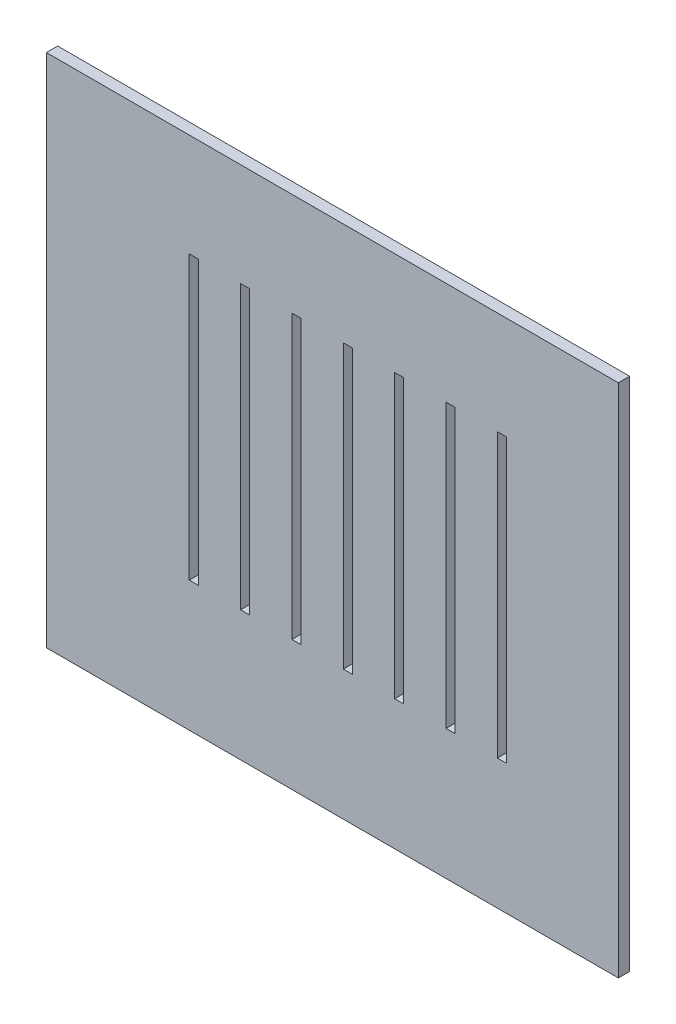
ISO-10303-21;
HEADER;
FILE_DESCRIPTION(('STEP AP214'),'2;1');
FILE_NAME('part.step','',(''),(''),'','','');
FILE_SCHEMA(('AUTOMOTIVE_DESIGN { 1 0 10303 214 1 1 1 1 }'));
ENDSEC;
DATA;
#1=APPLICATION_CONTEXT('core data for automotive mechanical design processes');
#2=APPLICATION_PROTOCOL_DEFINITION('international standard','automotive_design',2000,#1);
#3=PRODUCT_CONTEXT('',#1,'mechanical');
#4=PRODUCT('Part','Part','',(#3));
#5=PRODUCT_RELATED_PRODUCT_CATEGORY('part','',(#4));
#6=PRODUCT_DEFINITION_FORMATION('','',#4);
#7=PRODUCT_DEFINITION_CONTEXT('part definition',#1,'design');
#8=PRODUCT_DEFINITION('design','',#6,#7);
#9=PRODUCT_DEFINITION_SHAPE('','',#8);
#10=(LENGTH_UNIT() NAMED_UNIT(*) SI_UNIT(.MILLI.,.METRE.));
#11=(NAMED_UNIT(*) PLANE_ANGLE_UNIT() SI_UNIT($,.RADIAN.));
#12=(NAMED_UNIT(*) SI_UNIT($,.STERADIAN.) SOLID_ANGLE_UNIT());
#13=UNCERTAINTY_MEASURE_WITH_UNIT(LENGTH_MEASURE(1.E-05),#10,'distance_accuracy_value','');
#14=(GEOMETRIC_REPRESENTATION_CONTEXT(3) GLOBAL_UNCERTAINTY_ASSIGNED_CONTEXT((#13)) GLOBAL_UNIT_ASSIGNED_CONTEXT((#10,
#11,#12)) REPRESENTATION_CONTEXT('',''));
#15=CARTESIAN_POINT('',(0.,0.,0.));
#16=DIRECTION('',(0.,0.,1.));
#17=DIRECTION('',(1.,0.,0.));
#18=AXIS2_PLACEMENT_3D('',#15,#16,#17);
#19=CARTESIAN_POINT('',(96.0127000254001,96.5595192728388,2.));
#20=DIRECTION('',(0.,-1.,0.));
#21=DIRECTION('',(0.,0.,-1.));
#22=AXIS2_PLACEMENT_3D('',#19,#20,#21);
#23=PLANE('',#22);
#24=DIRECTION('',(-1.,0.,0.));
#25=VECTOR('',#24,1.);
#26=CARTESIAN_POINT('',(96.0127000254001,96.5595192728388,0.));
#27=LINE('',#26,#25);
#28=CARTESIAN_POINT('',(96.0127000254001,96.5595192728388,0.));
#29=VERTEX_POINT('',#28);
#30=CARTESIAN_POINT('',(-5.18729997459996,96.5595192728388,0.));
#31=VERTEX_POINT('',#30);
#32=EDGE_CURVE('E544',#29,#31,#27,.T.);
#33=ORIENTED_EDGE('',*,*,#32,.T.);
#34=DIRECTION('',(0.,0.,-1.));
#35=VECTOR('',#34,1.);
#36=CARTESIAN_POINT('',(-5.18729997459996,96.5595192728388,2.));
#37=LINE('',#36,#35);
#38=CARTESIAN_POINT('',(-5.18729997459996,96.5595192728388,2.));
#39=VERTEX_POINT('',#38);
#40=EDGE_CURVE('E11',#39,#31,#37,.T.);
#41=ORIENTED_EDGE('',*,*,#40,.F.);
#42=DIRECTION('',(-1.,0.,0.));
#43=VECTOR('',#42,1.);
#44=CARTESIAN_POINT('',(96.0127000254001,96.5595192728388,2.));
#45=LINE('',#44,#43);
#46=CARTESIAN_POINT('',(96.0127000254001,96.5595192728388,2.));
#47=VERTEX_POINT('',#46);
#48=EDGE_CURVE('E545',#47,#39,#45,.T.);
#49=ORIENTED_EDGE('',*,*,#48,.F.);
#50=DIRECTION('',(0.,0.,-1.));
#51=VECTOR('',#50,1.);
#52=CARTESIAN_POINT('',(96.0127000254001,96.5595192728388,2.));
#53=LINE('',#52,#51);
#54=EDGE_CURVE('E559',#47,#29,#53,.T.);
#55=ORIENTED_EDGE('',*,*,#54,.T.);
#56=EDGE_LOOP('',(#33,#41,#49,#55));
#57=FACE_BOUND('',#56,.T.);
#58=ADVANCED_FACE('F43',(#57),#23,.F.);
#59=CARTESIAN_POINT('',(-5.18729997459996,96.5595192728388,2.));
#60=DIRECTION('',(1.,0.,0.));
#61=DIRECTION('',(0.,0.,-1.));
#62=AXIS2_PLACEMENT_3D('',#59,#60,#61);
#63=PLANE('',#62);
#64=DIRECTION('',(0.,-1.,0.));
#65=VECTOR('',#64,1.);
#66=CARTESIAN_POINT('',(-5.18729997459996,96.5595192728388,0.));
#67=LINE('',#66,#65);
#68=CARTESIAN_POINT('',(-5.18729997459996,5.35951927283882,0.));
#69=VERTEX_POINT('',#68);
#70=EDGE_CURVE('E563',#31,#69,#67,.T.);
#71=ORIENTED_EDGE('',*,*,#70,.T.);
#72=DIRECTION('',(0.,0.,-1.));
#73=VECTOR('',#72,1.);
#74=CARTESIAN_POINT('',(-5.18729997459996,5.35951927283882,2.));
#75=LINE('',#74,#73);
#76=CARTESIAN_POINT('',(-5.18729997459996,5.35951927283882,2.));
#77=VERTEX_POINT('',#76);
#78=EDGE_CURVE('E51',#77,#69,#75,.T.);
#79=ORIENTED_EDGE('',*,*,#78,.F.);
#80=DIRECTION('',(0.,-1.,0.));
#81=VECTOR('',#80,1.);
#82=CARTESIAN_POINT('',(-5.18729997459996,96.5595192728388,2.));
#83=LINE('',#82,#81);
#84=EDGE_CURVE('E549',#39,#77,#83,.T.);
#85=ORIENTED_EDGE('',*,*,#84,.F.);
#86=ORIENTED_EDGE('',*,*,#40,.T.);
#87=EDGE_LOOP('',(#71,#79,#85,#86));
#88=FACE_BOUND('',#87,.T.);
#89=ADVANCED_FACE('F586',(#88),#63,.F.);
#90=CARTESIAN_POINT('',(94.8127000254001,5.35951927283882,2.));
#91=DIRECTION('',(0.,1.,0.));
#92=DIRECTION('',(0.,0.,1.));
#93=AXIS2_PLACEMENT_3D('',#90,#91,#92);
#94=PLANE('',#93);
#95=DIRECTION('',(1.,0.,0.));
#96=VECTOR('',#95,1.);
#97=CARTESIAN_POINT('',(94.8127000254001,5.35951927283882,0.));
#98=LINE('',#97,#96);
#99=CARTESIAN_POINT('',(96.0127000254001,5.35951927283882,0.));
#100=VERTEX_POINT('',#99);
#101=EDGE_CURVE('E567',#69,#100,#98,.T.);
#102=ORIENTED_EDGE('',*,*,#101,.T.);
#103=DIRECTION('',(0.,0.,-1.));
#104=VECTOR('',#103,1.);
#105=CARTESIAN_POINT('',(96.0127000254001,5.35951927283882,2.));
#106=LINE('',#105,#104);
#107=CARTESIAN_POINT('',(96.0127000254001,5.35951927283882,2.));
#108=VERTEX_POINT('',#107);
#109=EDGE_CURVE('E575',#108,#100,#106,.T.);
#110=ORIENTED_EDGE('',*,*,#109,.F.);
#111=DIRECTION('',(1.,0.,0.));
#112=VECTOR('',#111,1.);
#113=CARTESIAN_POINT('',(-5.18729997459996,5.35951927283882,2.));
#114=LINE('',#113,#112);
#115=EDGE_CURVE('E553',#77,#108,#114,.T.);
#116=ORIENTED_EDGE('',*,*,#115,.F.);
#117=ORIENTED_EDGE('',*,*,#78,.T.);
#118=EDGE_LOOP('',(#102,#110,#116,#117));
#119=FACE_BOUND('',#118,.T.);
#120=ADVANCED_FACE('F583',(#119),#94,.F.);
#121=CARTESIAN_POINT('',(96.0127000254001,5.35951927283882,2.));
#122=DIRECTION('',(-1.,0.,0.));
#123=DIRECTION('',(0.,0.,1.));
#124=AXIS2_PLACEMENT_3D('',#121,#122,#123);
#125=PLANE('',#124);
#126=DIRECTION('',(0.,1.,0.));
#127=VECTOR('',#126,1.);
#128=CARTESIAN_POINT('',(96.0127000254001,5.35951927283882,0.));
#129=LINE('',#128,#127);
#130=EDGE_CURVE('E550',#100,#29,#129,.T.);
#131=ORIENTED_EDGE('',*,*,#130,.T.);
#132=ORIENTED_EDGE('',*,*,#54,.F.);
#133=DIRECTION('',(0.,1.,0.));
#134=VECTOR('',#133,1.);
#135=CARTESIAN_POINT('',(96.0127000254001,5.35951927283882,2.));
#136=LINE('',#135,#134);
#137=EDGE_CURVE('E556',#108,#47,#136,.T.);
#138=ORIENTED_EDGE('',*,*,#137,.F.);
#139=ORIENTED_EDGE('',*,*,#109,.T.);
#140=EDGE_LOOP('',(#131,#132,#138,#139));
#141=FACE_BOUND('',#140,.T.);
#142=ADVANCED_FACE('F593',(#141),#125,.F.);
#143=CARTESIAN_POINT('',(0.,0.,2.));
#144=DIRECTION('',(0.,0.,1.));
#145=DIRECTION('',(1.,0.,0.));
#146=AXIS2_PLACEMENT_3D('',#143,#144,#145);
#147=PLANE('',#146);
#148=DIRECTION('',(0.,-1.,0.));
#149=VECTOR('',#148,1.);
#150=CARTESIAN_POINT('',(20.0937774119431,0.,2.));
#151=LINE('',#150,#149);
#152=CARTESIAN_POINT('',(20.0937774119431,78.3595192728388,2.));
#153=VERTEX_POINT('',#152);
#154=CARTESIAN_POINT('',(20.0937774119431,28.3595192728388,2.));
#155=VERTEX_POINT('',#154);
#156=EDGE_CURVE('E541',#153,#155,#151,.T.);
#157=ORIENTED_EDGE('',*,*,#156,.F.);
#158=DIRECTION('',(-1.,0.,0.));
#159=VECTOR('',#158,1.);
#160=CARTESIAN_POINT('',(0.,78.3595192728388,2.));
#161=LINE('',#160,#159);
#162=CARTESIAN_POINT('',(21.6937774119431,78.3595192728388,2.));
#163=VERTEX_POINT('',#162);
#164=EDGE_CURVE('E533',#163,#153,#161,.T.);
#165=ORIENTED_EDGE('',*,*,#164,.F.);
#166=DIRECTION('',(0.,1.,0.));
#167=VECTOR('',#166,1.);
#168=CARTESIAN_POINT('',(21.6937774119431,0.,2.));
#169=LINE('',#168,#167);
#170=CARTESIAN_POINT('',(21.6937774119431,28.3595192728388,2.));
#171=VERTEX_POINT('',#170);
#172=EDGE_CURVE('E257',#171,#163,#169,.T.);
#173=ORIENTED_EDGE('',*,*,#172,.F.);
#174=DIRECTION('',(1.,0.,0.));
#175=VECTOR('',#174,1.);
#176=CARTESIAN_POINT('',(0.,28.3595192728388,2.));
#177=LINE('',#176,#175);
#178=EDGE_CURVE('E538',#155,#171,#177,.T.);
#179=ORIENTED_EDGE('',*,*,#178,.F.);
#180=EDGE_LOOP('',(#157,#165,#173,#179));
#181=FACE_BOUND('',#180,.T.);
#182=DIRECTION('',(1.,0.,0.));
#183=VECTOR('',#182,1.);
#184=CARTESIAN_POINT('',(0.,28.3595192728388,2.));
#185=LINE('',#184,#183);
#186=CARTESIAN_POINT('',(29.1802645141859,28.3595192728388,2.));
#187=VERTEX_POINT('',#186);
#188=CARTESIAN_POINT('',(30.7802645141859,28.3595192728388,2.));
#189=VERTEX_POINT('',#188);
#190=EDGE_CURVE('E530',#187,#189,#185,.T.);
#191=ORIENTED_EDGE('',*,*,#190,.F.);
#192=DIRECTION('',(0.,-1.,0.));
#193=VECTOR('',#192,1.);
#194=CARTESIAN_POINT('',(29.1802645141859,0.,2.));
#195=LINE('',#194,#193);
#196=CARTESIAN_POINT('',(29.1802645141859,78.3595192728388,2.));
#197=VERTEX_POINT('',#196);
#198=EDGE_CURVE('E521',#197,#187,#195,.T.);
#199=ORIENTED_EDGE('',*,*,#198,.F.);
#200=DIRECTION('',(-1.,0.,0.));
#201=VECTOR('',#200,1.);
#202=CARTESIAN_POINT('',(0.,78.3595192728388,2.));
#203=LINE('',#202,#201);
#204=CARTESIAN_POINT('',(30.7802645141859,78.3595192728388,2.));
#205=VERTEX_POINT('',#204);
#206=EDGE_CURVE('E524',#205,#197,#203,.T.);
#207=ORIENTED_EDGE('',*,*,#206,.F.);
#208=DIRECTION('',(0.,1.,0.));
#209=VECTOR('',#208,1.);
#210=CARTESIAN_POINT('',(30.7802645141859,0.,2.));
#211=LINE('',#210,#209);
#212=EDGE_CURVE('E527',#189,#205,#211,.T.);
#213=ORIENTED_EDGE('',*,*,#212,.F.);
#214=EDGE_LOOP('',(#191,#199,#207,#213));
#215=FACE_BOUND('',#214,.T.);
#216=DIRECTION('',(1.,0.,0.));
#217=VECTOR('',#216,1.);
#218=CARTESIAN_POINT('',(0.,28.3595192728388,2.));
#219=LINE('',#218,#217);
#220=CARTESIAN_POINT('',(38.2667516164288,28.3595192728388,2.));
#221=VERTEX_POINT('',#220);
#222=CARTESIAN_POINT('',(39.8667516164288,28.3595192728388,2.));
#223=VERTEX_POINT('',#222);
#224=EDGE_CURVE('E518',#221,#223,#219,.T.);
#225=ORIENTED_EDGE('',*,*,#224,.F.);
#226=DIRECTION('',(0.,-1.,0.));
#227=VECTOR('',#226,1.);
#228=CARTESIAN_POINT('',(38.2667516164288,0.,2.));
#229=LINE('',#228,#227);
#230=CARTESIAN_POINT('',(38.2667516164288,78.3595192728388,2.));
#231=VERTEX_POINT('',#230);
#232=EDGE_CURVE('E508',#231,#221,#229,.T.);
#233=ORIENTED_EDGE('',*,*,#232,.F.);
#234=DIRECTION('',(-1.,0.,0.));
#235=VECTOR('',#234,1.);
#236=CARTESIAN_POINT('',(0.,78.3595192728388,2.));
#237=LINE('',#236,#235);
#238=CARTESIAN_POINT('',(39.8667516164288,78.3595192728388,2.));
#239=VERTEX_POINT('',#238);
#240=EDGE_CURVE('E511',#239,#231,#237,.T.);
#241=ORIENTED_EDGE('',*,*,#240,.F.);
#242=DIRECTION('',(0.,1.,0.));
#243=VECTOR('',#242,1.);
#244=CARTESIAN_POINT('',(39.8667516164288,0.,2.));
#245=LINE('',#244,#243);
#246=EDGE_CURVE('E515',#223,#239,#245,.T.);
#247=ORIENTED_EDGE('',*,*,#246,.F.);
#248=EDGE_LOOP('',(#225,#233,#241,#247));
#249=FACE_BOUND('',#248,.T.);
#250=DIRECTION('',(1.,0.,0.));
#251=VECTOR('',#250,1.);
#252=CARTESIAN_POINT('',(0.,28.3595192728388,2.));
#253=LINE('',#252,#251);
#254=CARTESIAN_POINT('',(47.3532387186716,28.3595192728388,2.));
#255=VERTEX_POINT('',#254);
#256=CARTESIAN_POINT('',(48.9532387186716,28.3595192728388,2.));
#257=VERTEX_POINT('',#256);
#258=EDGE_CURVE('E505',#255,#257,#253,.T.);
#259=ORIENTED_EDGE('',*,*,#258,.F.);
#260=DIRECTION('',(0.,-1.,0.));
#261=VECTOR('',#260,1.);
#262=CARTESIAN_POINT('',(47.3532387186716,0.,2.));
#263=LINE('',#262,#261);
#264=CARTESIAN_POINT('',(47.3532387186716,78.3595192728388,2.));
#265=VERTEX_POINT('',#264);
#266=EDGE_CURVE('E495',#265,#255,#263,.T.);
#267=ORIENTED_EDGE('',*,*,#266,.F.);
#268=DIRECTION('',(-1.,0.,0.));
#269=VECTOR('',#268,1.);
#270=CARTESIAN_POINT('',(0.,78.3595192728388,2.));
#271=LINE('',#270,#269);
#272=CARTESIAN_POINT('',(48.9532387186716,78.3595192728388,2.));
#273=VERTEX_POINT('',#272);
#274=EDGE_CURVE('E498',#273,#265,#271,.T.);
#275=ORIENTED_EDGE('',*,*,#274,.F.);
#276=DIRECTION('',(0.,1.,0.));
#277=VECTOR('',#276,1.);
#278=CARTESIAN_POINT('',(48.9532387186716,0.,2.));
#279=LINE('',#278,#277);
#280=EDGE_CURVE('E502',#257,#273,#279,.T.);
#281=ORIENTED_EDGE('',*,*,#280,.F.);
#282=EDGE_LOOP('',(#259,#267,#275,#281));
#283=FACE_BOUND('',#282,.T.);
#284=DIRECTION('',(1.,0.,0.));
#285=VECTOR('',#284,1.);
#286=CARTESIAN_POINT('',(0.,28.3595192728388,2.));
#287=LINE('',#286,#285);
#288=CARTESIAN_POINT('',(56.4397258209144,28.3595192728388,2.));
#289=VERTEX_POINT('',#288);
#290=CARTESIAN_POINT('',(58.0397258209144,28.3595192728388,2.));
#291=VERTEX_POINT('',#290);
#292=EDGE_CURVE('E492',#289,#291,#287,.T.);
#293=ORIENTED_EDGE('',*,*,#292,.F.);
#294=DIRECTION('',(0.,-1.,0.));
#295=VECTOR('',#294,1.);
#296=CARTESIAN_POINT('',(56.4397258209144,0.,2.));
#297=LINE('',#296,#295);
#298=CARTESIAN_POINT('',(56.4397258209144,78.3595192728388,2.));
#299=VERTEX_POINT('',#298);
#300=EDGE_CURVE('E482',#299,#289,#297,.T.);
#301=ORIENTED_EDGE('',*,*,#300,.F.);
#302=DIRECTION('',(-1.,0.,0.));
#303=VECTOR('',#302,1.);
#304=CARTESIAN_POINT('',(0.,78.3595192728388,2.));
#305=LINE('',#304,#303);
#306=CARTESIAN_POINT('',(58.0397258209144,78.3595192728388,2.));
#307=VERTEX_POINT('',#306);
#308=EDGE_CURVE('E485',#307,#299,#305,.T.);
#309=ORIENTED_EDGE('',*,*,#308,.F.);
#310=DIRECTION('',(0.,1.,0.));
#311=VECTOR('',#310,1.);
#312=CARTESIAN_POINT('',(58.0397258209144,0.,2.));
#313=LINE('',#312,#311);
#314=EDGE_CURVE('E489',#291,#307,#313,.T.);
#315=ORIENTED_EDGE('',*,*,#314,.F.);
#316=EDGE_LOOP('',(#293,#301,#309,#315));
#317=FACE_BOUND('',#316,.T.);
#318=DIRECTION('',(1.,0.,0.));
#319=VECTOR('',#318,1.);
#320=CARTESIAN_POINT('',(0.,28.3595192728388,2.));
#321=LINE('',#320,#319);
#322=CARTESIAN_POINT('',(65.5262129231572,28.3595192728388,2.));
#323=VERTEX_POINT('',#322);
#324=CARTESIAN_POINT('',(67.1262129231572,28.3595192728388,2.));
#325=VERTEX_POINT('',#324);
#326=EDGE_CURVE('E479',#323,#325,#321,.T.);
#327=ORIENTED_EDGE('',*,*,#326,.F.);
#328=DIRECTION('',(0.,-1.,0.));
#329=VECTOR('',#328,1.);
#330=CARTESIAN_POINT('',(65.5262129231572,0.,2.));
#331=LINE('',#330,#329);
#332=CARTESIAN_POINT('',(65.5262129231572,78.3595192728388,2.));
#333=VERTEX_POINT('',#332);
#334=EDGE_CURVE('E469',#333,#323,#331,.T.);
#335=ORIENTED_EDGE('',*,*,#334,.F.);
#336=DIRECTION('',(-1.,0.,0.));
#337=VECTOR('',#336,1.);
#338=CARTESIAN_POINT('',(0.,78.3595192728388,2.));
#339=LINE('',#338,#337);
#340=CARTESIAN_POINT('',(67.1262129231572,78.3595192728388,2.));
#341=VERTEX_POINT('',#340);
#342=EDGE_CURVE('E472',#341,#333,#339,.T.);
#343=ORIENTED_EDGE('',*,*,#342,.F.);
#344=DIRECTION('',(0.,1.,0.));
#345=VECTOR('',#344,1.);
#346=CARTESIAN_POINT('',(67.1262129231572,0.,2.));
#347=LINE('',#346,#345);
#348=EDGE_CURVE('E476',#325,#341,#347,.T.);
#349=ORIENTED_EDGE('',*,*,#348,.F.);
#350=EDGE_LOOP('',(#327,#335,#343,#349));
#351=FACE_BOUND('',#350,.T.);
#352=DIRECTION('',(1.,0.,0.));
#353=VECTOR('',#352,1.);
#354=CARTESIAN_POINT('',(0.,28.3595192728388,2.));
#355=LINE('',#354,#353);
#356=CARTESIAN_POINT('',(74.6127000254,28.3595192728388,2.));
#357=VERTEX_POINT('',#356);
#358=CARTESIAN_POINT('',(76.2127000254001,28.3595192728388,2.));
#359=VERTEX_POINT('',#358);
#360=EDGE_CURVE('E466',#357,#359,#355,.T.);
#361=ORIENTED_EDGE('',*,*,#360,.F.);
#362=DIRECTION('',(0.,-1.,0.));
#363=VECTOR('',#362,1.);
#364=CARTESIAN_POINT('',(74.6127000254,0.,2.));
#365=LINE('',#364,#363);
#366=CARTESIAN_POINT('',(74.6127000254001,78.3595192728388,2.));
#367=VERTEX_POINT('',#366);
#368=EDGE_CURVE('E286',#367,#357,#365,.T.);
#369=ORIENTED_EDGE('',*,*,#368,.F.);
#370=DIRECTION('',(-1.,0.,0.));
#371=VECTOR('',#370,1.);
#372=CARTESIAN_POINT('',(0.,78.3595192728388,2.));
#373=LINE('',#372,#371);
#374=CARTESIAN_POINT('',(76.2127000254001,78.3595192728388,2.));
#375=VERTEX_POINT('',#374);
#376=EDGE_CURVE('E459',#375,#367,#373,.T.);
#377=ORIENTED_EDGE('',*,*,#376,.F.);
#378=DIRECTION('',(0.,1.,0.));
#379=VECTOR('',#378,1.);
#380=CARTESIAN_POINT('',(76.2127000254001,0.,2.));
#381=LINE('',#380,#379);
#382=EDGE_CURVE('E463',#359,#375,#381,.T.);
#383=ORIENTED_EDGE('',*,*,#382,.F.);
#384=EDGE_LOOP('',(#361,#369,#377,#383));
#385=FACE_BOUND('',#384,.T.);
#386=ORIENTED_EDGE('',*,*,#48,.T.);
#387=ORIENTED_EDGE('',*,*,#84,.T.);
#388=ORIENTED_EDGE('',*,*,#115,.T.);
#389=ORIENTED_EDGE('',*,*,#137,.T.);
#390=EDGE_LOOP('',(#386,#387,#388,#389));
#391=FACE_BOUND('',#390,.T.);
#392=ADVANCED_FACE('F598',(#181,#215,#249,#283,#317,#351,#385,#391),#147,.T.);
#393=CARTESIAN_POINT('',(0.,0.,0.));
#394=DIRECTION('',(0.,0.,1.));
#395=DIRECTION('',(1.,0.,0.));
#396=AXIS2_PLACEMENT_3D('',#393,#394,#395);
#397=PLANE('',#396);
#398=DIRECTION('',(1.,0.,0.));
#399=VECTOR('',#398,1.);
#400=CARTESIAN_POINT('',(20.0937774119431,78.3595192728388,0.));
#401=LINE('',#400,#399);
#402=CARTESIAN_POINT('',(20.0937774119431,78.3595192728388,0.));
#403=VERTEX_POINT('',#402);
#404=CARTESIAN_POINT('',(21.6937774119431,78.3595192728388,0.));
#405=VERTEX_POINT('',#404);
#406=EDGE_CURVE('E265',#403,#405,#401,.T.);
#407=ORIENTED_EDGE('',*,*,#406,.F.);
#408=DIRECTION('',(0.,1.,0.));
#409=VECTOR('',#408,1.);
#410=CARTESIAN_POINT('',(20.0937774119431,28.3595192728388,0.));
#411=LINE('',#410,#409);
#412=CARTESIAN_POINT('',(20.0937774119431,28.3595192728388,0.));
#413=VERTEX_POINT('',#412);
#414=EDGE_CURVE('E271',#413,#403,#411,.T.);
#415=ORIENTED_EDGE('',*,*,#414,.F.);
#416=DIRECTION('',(-1.,0.,0.));
#417=VECTOR('',#416,1.);
#418=CARTESIAN_POINT('',(20.0937774119431,28.3595192728388,0.));
#419=LINE('',#418,#417);
#420=CARTESIAN_POINT('',(21.6937774119431,28.3595192728388,0.));
#421=VERTEX_POINT('',#420);
#422=EDGE_CURVE('E276',#421,#413,#419,.T.);
#423=ORIENTED_EDGE('',*,*,#422,.F.);
#424=DIRECTION('',(0.,-1.,0.));
#425=VECTOR('',#424,1.);
#426=CARTESIAN_POINT('',(21.6937774119431,28.3595192728388,0.));
#427=LINE('',#426,#425);
#428=EDGE_CURVE('E254',#405,#421,#427,.T.);
#429=ORIENTED_EDGE('',*,*,#428,.F.);
#430=EDGE_LOOP('',(#407,#415,#423,#429));
#431=FACE_BOUND('',#430,.T.);
#432=DIRECTION('',(0.,1.,0.));
#433=VECTOR('',#432,1.);
#434=CARTESIAN_POINT('',(29.1802645141859,28.3595192728388,0.));
#435=LINE('',#434,#433);
#436=CARTESIAN_POINT('',(29.1802645141859,28.3595192728388,0.));
#437=VERTEX_POINT('',#436);
#438=CARTESIAN_POINT('',(29.1802645141859,78.3595192728388,0.));
#439=VERTEX_POINT('',#438);
#440=EDGE_CURVE('E312',#437,#439,#435,.T.);
#441=ORIENTED_EDGE('',*,*,#440,.F.);
#442=DIRECTION('',(-1.,0.,0.));
#443=VECTOR('',#442,1.);
#444=CARTESIAN_POINT('',(29.1802645141859,28.3595192728388,0.));
#445=LINE('',#444,#443);
#446=CARTESIAN_POINT('',(30.7802645141859,28.3595192728388,0.));
#447=VERTEX_POINT('',#446);
#448=EDGE_CURVE('E315',#447,#437,#445,.T.);
#449=ORIENTED_EDGE('',*,*,#448,.F.);
#450=DIRECTION('',(0.,-1.,0.));
#451=VECTOR('',#450,1.);
#452=CARTESIAN_POINT('',(30.7802645141859,28.3595192728388,0.));
#453=LINE('',#452,#451);
#454=CARTESIAN_POINT('',(30.7802645141859,78.3595192728388,0.));
#455=VERTEX_POINT('',#454);
#456=EDGE_CURVE('E295',#455,#447,#453,.T.);
#457=ORIENTED_EDGE('',*,*,#456,.F.);
#458=DIRECTION('',(1.,0.,0.));
#459=VECTOR('',#458,1.);
#460=CARTESIAN_POINT('',(29.1802645141859,78.3595192728388,0.));
#461=LINE('',#460,#459);
#462=EDGE_CURVE('E308',#439,#455,#461,.T.);
#463=ORIENTED_EDGE('',*,*,#462,.F.);
#464=EDGE_LOOP('',(#441,#449,#457,#463));
#465=FACE_BOUND('',#464,.T.);
#466=DIRECTION('',(0.,1.,0.));
#467=VECTOR('',#466,1.);
#468=CARTESIAN_POINT('',(38.2667516164288,28.3595192728388,0.));
#469=LINE('',#468,#467);
#470=CARTESIAN_POINT('',(38.2667516164288,28.3595192728388,0.));
#471=VERTEX_POINT('',#470);
#472=CARTESIAN_POINT('',(38.2667516164288,78.3595192728388,0.));
#473=VERTEX_POINT('',#472);
#474=EDGE_CURVE('E340',#471,#473,#469,.T.);
#475=ORIENTED_EDGE('',*,*,#474,.F.);
#476=DIRECTION('',(-1.,0.,0.));
#477=VECTOR('',#476,1.);
#478=CARTESIAN_POINT('',(38.2667516164288,28.3595192728388,0.));
#479=LINE('',#478,#477);
#480=CARTESIAN_POINT('',(39.8667516164288,28.3595192728388,0.));
#481=VERTEX_POINT('',#480);
#482=EDGE_CURVE('E304',#481,#471,#479,.T.);
#483=ORIENTED_EDGE('',*,*,#482,.F.);
#484=DIRECTION('',(0.,-1.,0.));
#485=VECTOR('',#484,1.);
#486=CARTESIAN_POINT('',(39.8667516164288,28.3595192728388,0.));
#487=LINE('',#486,#485);
#488=CARTESIAN_POINT('',(39.8667516164288,78.3595192728388,0.));
#489=VERTEX_POINT('',#488);
#490=EDGE_CURVE('E322',#489,#481,#487,.T.);
#491=ORIENTED_EDGE('',*,*,#490,.F.);
#492=DIRECTION('',(1.,0.,0.));
#493=VECTOR('',#492,1.);
#494=CARTESIAN_POINT('',(38.2667516164288,78.3595192728388,0.));
#495=LINE('',#494,#493);
#496=EDGE_CURVE('E336',#473,#489,#495,.T.);
#497=ORIENTED_EDGE('',*,*,#496,.F.);
#498=EDGE_LOOP('',(#475,#483,#491,#497));
#499=FACE_BOUND('',#498,.T.);
#500=DIRECTION('',(0.,1.,0.));
#501=VECTOR('',#500,1.);
#502=CARTESIAN_POINT('',(47.3532387186716,28.3595192728388,0.));
#503=LINE('',#502,#501);
#504=CARTESIAN_POINT('',(47.3532387186716,28.3595192728388,0.));
#505=VERTEX_POINT('',#504);
#506=CARTESIAN_POINT('',(47.3532387186716,78.3595192728388,0.));
#507=VERTEX_POINT('',#506);
#508=EDGE_CURVE('E368',#505,#507,#503,.T.);
#509=ORIENTED_EDGE('',*,*,#508,.F.);
#510=DIRECTION('',(-1.,0.,0.));
#511=VECTOR('',#510,1.);
#512=CARTESIAN_POINT('',(47.3532387186716,28.3595192728388,0.));
#513=LINE('',#512,#511);
#514=CARTESIAN_POINT('',(48.9532387186716,28.3595192728388,0.));
#515=VERTEX_POINT('',#514);
#516=EDGE_CURVE('E332',#515,#505,#513,.T.);
#517=ORIENTED_EDGE('',*,*,#516,.F.);
#518=DIRECTION('',(0.,-1.,0.));
#519=VECTOR('',#518,1.);
#520=CARTESIAN_POINT('',(48.9532387186716,28.3595192728388,0.));
#521=LINE('',#520,#519);
#522=CARTESIAN_POINT('',(48.9532387186716,78.3595192728388,0.));
#523=VERTEX_POINT('',#522);
#524=EDGE_CURVE('E350',#523,#515,#521,.T.);
#525=ORIENTED_EDGE('',*,*,#524,.F.);
#526=DIRECTION('',(1.,0.,0.));
#527=VECTOR('',#526,1.);
#528=CARTESIAN_POINT('',(47.3532387186716,78.3595192728388,0.));
#529=LINE('',#528,#527);
#530=EDGE_CURVE('E364',#507,#523,#529,.T.);
#531=ORIENTED_EDGE('',*,*,#530,.F.);
#532=EDGE_LOOP('',(#509,#517,#525,#531));
#533=FACE_BOUND('',#532,.T.);
#534=DIRECTION('',(0.,1.,0.));
#535=VECTOR('',#534,1.);
#536=CARTESIAN_POINT('',(56.4397258209144,28.3595192728388,0.));
#537=LINE('',#536,#535);
#538=CARTESIAN_POINT('',(56.4397258209144,28.3595192728388,0.));
#539=VERTEX_POINT('',#538);
#540=CARTESIAN_POINT('',(56.4397258209144,78.3595192728388,0.));
#541=VERTEX_POINT('',#540);
#542=EDGE_CURVE('E396',#539,#541,#537,.T.);
#543=ORIENTED_EDGE('',*,*,#542,.F.);
#544=DIRECTION('',(-1.,0.,0.));
#545=VECTOR('',#544,1.);
#546=CARTESIAN_POINT('',(56.4397258209144,28.3595192728388,0.));
#547=LINE('',#546,#545);
#548=CARTESIAN_POINT('',(58.0397258209144,28.3595192728388,0.));
#549=VERTEX_POINT('',#548);
#550=EDGE_CURVE('E360',#549,#539,#547,.T.);
#551=ORIENTED_EDGE('',*,*,#550,.F.);
#552=DIRECTION('',(0.,-1.,0.));
#553=VECTOR('',#552,1.);
#554=CARTESIAN_POINT('',(58.0397258209144,28.3595192728388,0.));
#555=LINE('',#554,#553);
#556=CARTESIAN_POINT('',(58.0397258209144,78.3595192728388,0.));
#557=VERTEX_POINT('',#556);
#558=EDGE_CURVE('E378',#557,#549,#555,.T.);
#559=ORIENTED_EDGE('',*,*,#558,.F.);
#560=DIRECTION('',(1.,0.,0.));
#561=VECTOR('',#560,1.);
#562=CARTESIAN_POINT('',(56.4397258209144,78.3595192728388,0.));
#563=LINE('',#562,#561);
#564=EDGE_CURVE('E392',#541,#557,#563,.T.);
#565=ORIENTED_EDGE('',*,*,#564,.F.);
#566=EDGE_LOOP('',(#543,#551,#559,#565));
#567=FACE_BOUND('',#566,.T.);
#568=DIRECTION('',(0.,1.,0.));
#569=VECTOR('',#568,1.);
#570=CARTESIAN_POINT('',(65.5262129231572,28.3595192728388,0.));
#571=LINE('',#570,#569);
#572=CARTESIAN_POINT('',(65.5262129231572,28.3595192728388,0.));
#573=VERTEX_POINT('',#572);
#574=CARTESIAN_POINT('',(65.5262129231572,78.3595192728388,0.));
#575=VERTEX_POINT('',#574);
#576=EDGE_CURVE('E424',#573,#575,#571,.T.);
#577=ORIENTED_EDGE('',*,*,#576,.F.);
#578=DIRECTION('',(-1.,0.,0.));
#579=VECTOR('',#578,1.);
#580=CARTESIAN_POINT('',(65.5262129231572,28.3595192728388,0.));
#581=LINE('',#580,#579);
#582=CARTESIAN_POINT('',(67.1262129231572,28.3595192728388,0.));
#583=VERTEX_POINT('',#582);
#584=EDGE_CURVE('E388',#583,#573,#581,.T.);
#585=ORIENTED_EDGE('',*,*,#584,.F.);
#586=DIRECTION('',(0.,-1.,0.));
#587=VECTOR('',#586,1.);
#588=CARTESIAN_POINT('',(67.1262129231572,28.3595192728388,0.));
#589=LINE('',#588,#587);
#590=CARTESIAN_POINT('',(67.1262129231572,78.3595192728388,0.));
#591=VERTEX_POINT('',#590);
#592=EDGE_CURVE('E406',#591,#583,#589,.T.);
#593=ORIENTED_EDGE('',*,*,#592,.F.);
#594=DIRECTION('',(1.,0.,0.));
#595=VECTOR('',#594,1.);
#596=CARTESIAN_POINT('',(65.5262129231572,78.3595192728388,0.));
#597=LINE('',#596,#595);
#598=EDGE_CURVE('E420',#575,#591,#597,.T.);
#599=ORIENTED_EDGE('',*,*,#598,.F.);
#600=EDGE_LOOP('',(#577,#585,#593,#599));
#601=FACE_BOUND('',#600,.T.);
#602=DIRECTION('',(0.,1.,0.));
#603=VECTOR('',#602,1.);
#604=CARTESIAN_POINT('',(74.6127000254,28.3595192728388,0.));
#605=LINE('',#604,#603);
#606=CARTESIAN_POINT('',(74.6127000254,28.3595192728388,0.));
#607=VERTEX_POINT('',#606);
#608=CARTESIAN_POINT('',(74.6127000254001,78.3595192728388,0.));
#609=VERTEX_POINT('',#608);
#610=EDGE_CURVE('E451',#607,#609,#605,.T.);
#611=ORIENTED_EDGE('',*,*,#610,.F.);
#612=DIRECTION('',(-1.,0.,0.));
#613=VECTOR('',#612,1.);
#614=CARTESIAN_POINT('',(74.6127000254,28.3595192728388,0.));
#615=LINE('',#614,#613);
#616=CARTESIAN_POINT('',(76.2127000254001,28.3595192728388,0.));
#617=VERTEX_POINT('',#616);
#618=EDGE_CURVE('E416',#617,#607,#615,.T.);
#619=ORIENTED_EDGE('',*,*,#618,.F.);
#620=DIRECTION('',(0.,-1.,0.));
#621=VECTOR('',#620,1.);
#622=CARTESIAN_POINT('',(76.2127000254001,28.3595192728388,0.));
#623=LINE('',#622,#621);
#624=CARTESIAN_POINT('',(76.2127000254001,78.3595192728388,0.));
#625=VERTEX_POINT('',#624);
#626=EDGE_CURVE('E434',#625,#617,#623,.T.);
#627=ORIENTED_EDGE('',*,*,#626,.F.);
#628=DIRECTION('',(1.,0.,0.));
#629=VECTOR('',#628,1.);
#630=CARTESIAN_POINT('',(74.6127000254001,78.3595192728388,0.));
#631=LINE('',#630,#629);
#632=EDGE_CURVE('E447',#609,#625,#631,.T.);
#633=ORIENTED_EDGE('',*,*,#632,.F.);
#634=EDGE_LOOP('',(#611,#619,#627,#633));
#635=FACE_BOUND('',#634,.T.);
#636=ORIENTED_EDGE('',*,*,#32,.F.);
#637=ORIENTED_EDGE('',*,*,#130,.F.);
#638=ORIENTED_EDGE('',*,*,#101,.F.);
#639=ORIENTED_EDGE('',*,*,#70,.F.);
#640=EDGE_LOOP('',(#636,#637,#638,#639));
#641=FACE_BOUND('',#640,.T.);
#642=ADVANCED_FACE('F273',(#431,#465,#499,#533,#567,#601,#635,#641),#397,.F.);
#643=CARTESIAN_POINT('',(74.6127000254,28.3595192728388,10.));
#644=DIRECTION('',(0.,-1.,0.));
#645=DIRECTION('',(0.,0.,-1.));
#646=AXIS2_PLACEMENT_3D('',#643,#644,#645);
#647=PLANE('',#646);
#648=ORIENTED_EDGE('',*,*,#360,.T.);
#649=DIRECTION('',(0.,0.,-1.));
#650=VECTOR('',#649,1.);
#651=CARTESIAN_POINT('',(76.2127000254001,28.3595192728388,10.));
#652=LINE('',#651,#650);
#653=EDGE_CURVE('E441',#359,#617,#652,.T.);
#654=ORIENTED_EDGE('',*,*,#653,.T.);
#655=ORIENTED_EDGE('',*,*,#618,.T.);
#656=DIRECTION('',(0.,0.,-1.));
#657=VECTOR('',#656,1.);
#658=CARTESIAN_POINT('',(74.6127000254,28.3595192728388,10.));
#659=LINE('',#658,#657);
#660=EDGE_CURVE('E430',#357,#607,#659,.T.);
#661=ORIENTED_EDGE('',*,*,#660,.F.);
#662=EDGE_LOOP('',(#648,#654,#655,#661));
#663=FACE_BOUND('',#662,.T.);
#664=ADVANCED_FACE('F606',(#663),#647,.F.);
#665=CARTESIAN_POINT('',(76.2127000254001,28.3595192728388,10.));
#666=DIRECTION('',(1.,0.,0.));
#667=DIRECTION('',(0.,0.,-1.));
#668=AXIS2_PLACEMENT_3D('',#665,#666,#667);
#669=PLANE('',#668);
#670=ORIENTED_EDGE('',*,*,#382,.T.);
#671=DIRECTION('',(0.,0.,-1.));
#672=VECTOR('',#671,1.);
#673=CARTESIAN_POINT('',(76.2127000254001,78.3595192728388,10.));
#674=LINE('',#673,#672);
#675=EDGE_CURVE('E438',#375,#625,#674,.T.);
#676=ORIENTED_EDGE('',*,*,#675,.T.);
#677=ORIENTED_EDGE('',*,*,#626,.T.);
#678=ORIENTED_EDGE('',*,*,#653,.F.);
#679=EDGE_LOOP('',(#670,#676,#677,#678));
#680=FACE_BOUND('',#679,.T.);
#681=ADVANCED_FACE('F648',(#680),#669,.F.);
#682=CARTESIAN_POINT('',(74.6127000254001,78.3595192728388,10.));
#683=DIRECTION('',(0.,1.,0.));
#684=DIRECTION('',(0.,0.,1.));
#685=AXIS2_PLACEMENT_3D('',#682,#683,#684);
#686=PLANE('',#685);
#687=ORIENTED_EDGE('',*,*,#376,.T.);
#688=DIRECTION('',(0.,0.,-1.));
#689=VECTOR('',#688,1.);
#690=CARTESIAN_POINT('',(74.6127000254001,78.3595192728388,10.));
#691=LINE('',#690,#689);
#692=EDGE_CURVE('E435',#367,#609,#691,.T.);
#693=ORIENTED_EDGE('',*,*,#692,.T.);
#694=ORIENTED_EDGE('',*,*,#632,.T.);
#695=ORIENTED_EDGE('',*,*,#675,.F.);
#696=EDGE_LOOP('',(#687,#693,#694,#695));
#697=FACE_BOUND('',#696,.T.);
#698=ADVANCED_FACE('F659',(#697),#686,.F.);
#699=CARTESIAN_POINT('',(74.6127000254,28.3595192728388,10.));
#700=DIRECTION('',(-1.,0.,0.));
#701=DIRECTION('',(0.,-1.,0.));
#702=AXIS2_PLACEMENT_3D('',#699,#700,#701);
#703=PLANE('',#702);
#704=ORIENTED_EDGE('',*,*,#368,.T.);
#705=ORIENTED_EDGE('',*,*,#660,.T.);
#706=ORIENTED_EDGE('',*,*,#610,.T.);
#707=ORIENTED_EDGE('',*,*,#692,.F.);
#708=EDGE_LOOP('',(#704,#705,#706,#707));
#709=FACE_BOUND('',#708,.T.);
#710=ADVANCED_FACE('F669',(#709),#703,.F.);
#711=CARTESIAN_POINT('',(65.5262129231572,28.3595192728388,10.));
#712=DIRECTION('',(0.,-1.,0.));
#713=DIRECTION('',(0.,0.,-1.));
#714=AXIS2_PLACEMENT_3D('',#711,#712,#713);
#715=PLANE('',#714);
#716=ORIENTED_EDGE('',*,*,#326,.T.);
#717=DIRECTION('',(0.,0.,-1.));
#718=VECTOR('',#717,1.);
#719=CARTESIAN_POINT('',(67.1262129231572,28.3595192728388,10.));
#720=LINE('',#719,#718);
#721=EDGE_CURVE('E413',#325,#583,#720,.T.);
#722=ORIENTED_EDGE('',*,*,#721,.T.);
#723=ORIENTED_EDGE('',*,*,#584,.T.);
#724=DIRECTION('',(0.,0.,-1.));
#725=VECTOR('',#724,1.);
#726=CARTESIAN_POINT('',(65.5262129231572,28.3595192728388,10.));
#727=LINE('',#726,#725);
#728=EDGE_CURVE('E402',#323,#573,#727,.T.);
#729=ORIENTED_EDGE('',*,*,#728,.F.);
#730=EDGE_LOOP('',(#716,#722,#723,#729));
#731=FACE_BOUND('',#730,.T.);
#732=ADVANCED_FACE('F680',(#731),#715,.F.);
#733=CARTESIAN_POINT('',(67.1262129231572,28.3595192728388,10.));
#734=DIRECTION('',(1.,0.,0.));
#735=DIRECTION('',(0.,0.,-1.));
#736=AXIS2_PLACEMENT_3D('',#733,#734,#735);
#737=PLANE('',#736);
#738=ORIENTED_EDGE('',*,*,#348,.T.);
#739=DIRECTION('',(0.,0.,-1.));
#740=VECTOR('',#739,1.);
#741=CARTESIAN_POINT('',(67.1262129231572,78.3595192728388,10.));
#742=LINE('',#741,#740);
#743=EDGE_CURVE('E410',#341,#591,#742,.T.);
#744=ORIENTED_EDGE('',*,*,#743,.T.);
#745=ORIENTED_EDGE('',*,*,#592,.T.);
#746=ORIENTED_EDGE('',*,*,#721,.F.);
#747=EDGE_LOOP('',(#738,#744,#745,#746));
#748=FACE_BOUND('',#747,.T.);
#749=ADVANCED_FACE('F691',(#748),#737,.F.);
#750=CARTESIAN_POINT('',(65.5262129231572,78.3595192728388,10.));
#751=DIRECTION('',(0.,1.,0.));
#752=DIRECTION('',(0.,0.,1.));
#753=AXIS2_PLACEMENT_3D('',#750,#751,#752);
#754=PLANE('',#753);
#755=ORIENTED_EDGE('',*,*,#342,.T.);
#756=DIRECTION('',(0.,0.,-1.));
#757=VECTOR('',#756,1.);
#758=CARTESIAN_POINT('',(65.5262129231572,78.3595192728388,10.));
#759=LINE('',#758,#757);
#760=EDGE_CURVE('E407',#333,#575,#759,.T.);
#761=ORIENTED_EDGE('',*,*,#760,.T.);
#762=ORIENTED_EDGE('',*,*,#598,.T.);
#763=ORIENTED_EDGE('',*,*,#743,.F.);
#764=EDGE_LOOP('',(#755,#761,#762,#763));
#765=FACE_BOUND('',#764,.T.);
#766=ADVANCED_FACE('F702',(#765),#754,.F.);
#767=CARTESIAN_POINT('',(65.5262129231572,28.3595192728388,10.));
#768=DIRECTION('',(-1.,0.,0.));
#769=DIRECTION('',(0.,-1.,0.));
#770=AXIS2_PLACEMENT_3D('',#767,#768,#769);
#771=PLANE('',#770);
#772=ORIENTED_EDGE('',*,*,#334,.T.);
#773=ORIENTED_EDGE('',*,*,#728,.T.);
#774=ORIENTED_EDGE('',*,*,#576,.T.);
#775=ORIENTED_EDGE('',*,*,#760,.F.);
#776=EDGE_LOOP('',(#772,#773,#774,#775));
#777=FACE_BOUND('',#776,.T.);
#778=ADVANCED_FACE('F713',(#777),#771,.F.);
#779=CARTESIAN_POINT('',(56.4397258209144,28.3595192728388,10.));
#780=DIRECTION('',(0.,-1.,0.));
#781=DIRECTION('',(0.,0.,-1.));
#782=AXIS2_PLACEMENT_3D('',#779,#780,#781);
#783=PLANE('',#782);
#784=ORIENTED_EDGE('',*,*,#292,.T.);
#785=DIRECTION('',(0.,0.,-1.));
#786=VECTOR('',#785,1.);
#787=CARTESIAN_POINT('',(58.0397258209144,28.3595192728388,10.));
#788=LINE('',#787,#786);
#789=EDGE_CURVE('E385',#291,#549,#788,.T.);
#790=ORIENTED_EDGE('',*,*,#789,.T.);
#791=ORIENTED_EDGE('',*,*,#550,.T.);
#792=DIRECTION('',(0.,0.,-1.));
#793=VECTOR('',#792,1.);
#794=CARTESIAN_POINT('',(56.4397258209144,28.3595192728388,10.));
#795=LINE('',#794,#793);
#796=EDGE_CURVE('E374',#289,#539,#795,.T.);
#797=ORIENTED_EDGE('',*,*,#796,.F.);
#798=EDGE_LOOP('',(#784,#790,#791,#797));
#799=FACE_BOUND('',#798,.T.);
#800=ADVANCED_FACE('F724',(#799),#783,.F.);
#801=CARTESIAN_POINT('',(58.0397258209144,28.3595192728388,10.));
#802=DIRECTION('',(1.,0.,0.));
#803=DIRECTION('',(0.,0.,-1.));
#804=AXIS2_PLACEMENT_3D('',#801,#802,#803);
#805=PLANE('',#804);
#806=ORIENTED_EDGE('',*,*,#314,.T.);
#807=DIRECTION('',(0.,0.,-1.));
#808=VECTOR('',#807,1.);
#809=CARTESIAN_POINT('',(58.0397258209144,78.3595192728388,10.));
#810=LINE('',#809,#808);
#811=EDGE_CURVE('E382',#307,#557,#810,.T.);
#812=ORIENTED_EDGE('',*,*,#811,.T.);
#813=ORIENTED_EDGE('',*,*,#558,.T.);
#814=ORIENTED_EDGE('',*,*,#789,.F.);
#815=EDGE_LOOP('',(#806,#812,#813,#814));
#816=FACE_BOUND('',#815,.T.);
#817=ADVANCED_FACE('F735',(#816),#805,.F.);
#818=CARTESIAN_POINT('',(56.4397258209144,78.3595192728388,10.));
#819=DIRECTION('',(0.,1.,0.));
#820=DIRECTION('',(0.,0.,1.));
#821=AXIS2_PLACEMENT_3D('',#818,#819,#820);
#822=PLANE('',#821);
#823=ORIENTED_EDGE('',*,*,#308,.T.);
#824=DIRECTION('',(0.,0.,-1.));
#825=VECTOR('',#824,1.);
#826=CARTESIAN_POINT('',(56.4397258209144,78.3595192728388,10.));
#827=LINE('',#826,#825);
#828=EDGE_CURVE('E379',#299,#541,#827,.T.);
#829=ORIENTED_EDGE('',*,*,#828,.T.);
#830=ORIENTED_EDGE('',*,*,#564,.T.);
#831=ORIENTED_EDGE('',*,*,#811,.F.);
#832=EDGE_LOOP('',(#823,#829,#830,#831));
#833=FACE_BOUND('',#832,.T.);
#834=ADVANCED_FACE('F746',(#833),#822,.F.);
#835=CARTESIAN_POINT('',(56.4397258209144,28.3595192728388,10.));
#836=DIRECTION('',(-1.,0.,0.));
#837=DIRECTION('',(0.,-1.,0.));
#838=AXIS2_PLACEMENT_3D('',#835,#836,#837);
#839=PLANE('',#838);
#840=ORIENTED_EDGE('',*,*,#300,.T.);
#841=ORIENTED_EDGE('',*,*,#796,.T.);
#842=ORIENTED_EDGE('',*,*,#542,.T.);
#843=ORIENTED_EDGE('',*,*,#828,.F.);
#844=EDGE_LOOP('',(#840,#841,#842,#843));
#845=FACE_BOUND('',#844,.T.);
#846=ADVANCED_FACE('F757',(#845),#839,.F.);
#847=CARTESIAN_POINT('',(47.3532387186716,28.3595192728388,10.));
#848=DIRECTION('',(0.,-1.,0.));
#849=DIRECTION('',(0.,0.,-1.));
#850=AXIS2_PLACEMENT_3D('',#847,#848,#849);
#851=PLANE('',#850);
#852=ORIENTED_EDGE('',*,*,#258,.T.);
#853=DIRECTION('',(0.,0.,-1.));
#854=VECTOR('',#853,1.);
#855=CARTESIAN_POINT('',(48.9532387186716,28.3595192728388,10.));
#856=LINE('',#855,#854);
#857=EDGE_CURVE('E357',#257,#515,#856,.T.);
#858=ORIENTED_EDGE('',*,*,#857,.T.);
#859=ORIENTED_EDGE('',*,*,#516,.T.);
#860=DIRECTION('',(0.,0.,-1.));
#861=VECTOR('',#860,1.);
#862=CARTESIAN_POINT('',(47.3532387186716,28.3595192728388,10.));
#863=LINE('',#862,#861);
#864=EDGE_CURVE('E346',#255,#505,#863,.T.);
#865=ORIENTED_EDGE('',*,*,#864,.F.);
#866=EDGE_LOOP('',(#852,#858,#859,#865));
#867=FACE_BOUND('',#866,.T.);
#868=ADVANCED_FACE('F768',(#867),#851,.F.);
#869=CARTESIAN_POINT('',(48.9532387186716,28.3595192728388,10.));
#870=DIRECTION('',(1.,0.,0.));
#871=DIRECTION('',(0.,0.,-1.));
#872=AXIS2_PLACEMENT_3D('',#869,#870,#871);
#873=PLANE('',#872);
#874=ORIENTED_EDGE('',*,*,#280,.T.);
#875=DIRECTION('',(0.,0.,-1.));
#876=VECTOR('',#875,1.);
#877=CARTESIAN_POINT('',(48.9532387186716,78.3595192728388,10.));
#878=LINE('',#877,#876);
#879=EDGE_CURVE('E354',#273,#523,#878,.T.);
#880=ORIENTED_EDGE('',*,*,#879,.T.);
#881=ORIENTED_EDGE('',*,*,#524,.T.);
#882=ORIENTED_EDGE('',*,*,#857,.F.);
#883=EDGE_LOOP('',(#874,#880,#881,#882));
#884=FACE_BOUND('',#883,.T.);
#885=ADVANCED_FACE('F779',(#884),#873,.F.);
#886=CARTESIAN_POINT('',(47.3532387186716,78.3595192728388,10.));
#887=DIRECTION('',(0.,1.,0.));
#888=DIRECTION('',(0.,0.,1.));
#889=AXIS2_PLACEMENT_3D('',#886,#887,#888);
#890=PLANE('',#889);
#891=ORIENTED_EDGE('',*,*,#274,.T.);
#892=DIRECTION('',(0.,0.,-1.));
#893=VECTOR('',#892,1.);
#894=CARTESIAN_POINT('',(47.3532387186716,78.3595192728388,10.));
#895=LINE('',#894,#893);
#896=EDGE_CURVE('E351',#265,#507,#895,.T.);
#897=ORIENTED_EDGE('',*,*,#896,.T.);
#898=ORIENTED_EDGE('',*,*,#530,.T.);
#899=ORIENTED_EDGE('',*,*,#879,.F.);
#900=EDGE_LOOP('',(#891,#897,#898,#899));
#901=FACE_BOUND('',#900,.T.);
#902=ADVANCED_FACE('F790',(#901),#890,.F.);
#903=CARTESIAN_POINT('',(47.3532387186716,28.3595192728388,10.));
#904=DIRECTION('',(-1.,0.,0.));
#905=DIRECTION('',(0.,-1.,0.));
#906=AXIS2_PLACEMENT_3D('',#903,#904,#905);
#907=PLANE('',#906);
#908=ORIENTED_EDGE('',*,*,#266,.T.);
#909=ORIENTED_EDGE('',*,*,#864,.T.);
#910=ORIENTED_EDGE('',*,*,#508,.T.);
#911=ORIENTED_EDGE('',*,*,#896,.F.);
#912=EDGE_LOOP('',(#908,#909,#910,#911));
#913=FACE_BOUND('',#912,.T.);
#914=ADVANCED_FACE('F801',(#913),#907,.F.);
#915=CARTESIAN_POINT('',(38.2667516164288,28.3595192728388,10.));
#916=DIRECTION('',(0.,-1.,0.));
#917=DIRECTION('',(0.,0.,-1.));
#918=AXIS2_PLACEMENT_3D('',#915,#916,#917);
#919=PLANE('',#918);
#920=ORIENTED_EDGE('',*,*,#224,.T.);
#921=DIRECTION('',(0.,0.,-1.));
#922=VECTOR('',#921,1.);
#923=CARTESIAN_POINT('',(39.8667516164288,28.3595192728388,10.));
#924=LINE('',#923,#922);
#925=EDGE_CURVE('E329',#223,#481,#924,.T.);
#926=ORIENTED_EDGE('',*,*,#925,.T.);
#927=ORIENTED_EDGE('',*,*,#482,.T.);
#928=DIRECTION('',(0.,0.,-1.));
#929=VECTOR('',#928,1.);
#930=CARTESIAN_POINT('',(38.2667516164288,28.3595192728388,10.));
#931=LINE('',#930,#929);
#932=EDGE_CURVE('E318',#221,#471,#931,.T.);
#933=ORIENTED_EDGE('',*,*,#932,.F.);
#934=EDGE_LOOP('',(#920,#926,#927,#933));
#935=FACE_BOUND('',#934,.T.);
#936=ADVANCED_FACE('F812',(#935),#919,.F.);
#937=CARTESIAN_POINT('',(39.8667516164288,28.3595192728388,10.));
#938=DIRECTION('',(1.,0.,0.));
#939=DIRECTION('',(0.,0.,-1.));
#940=AXIS2_PLACEMENT_3D('',#937,#938,#939);
#941=PLANE('',#940);
#942=ORIENTED_EDGE('',*,*,#246,.T.);
#943=DIRECTION('',(0.,0.,-1.));
#944=VECTOR('',#943,1.);
#945=CARTESIAN_POINT('',(39.8667516164288,78.3595192728388,10.));
#946=LINE('',#945,#944);
#947=EDGE_CURVE('E326',#239,#489,#946,.T.);
#948=ORIENTED_EDGE('',*,*,#947,.T.);
#949=ORIENTED_EDGE('',*,*,#490,.T.);
#950=ORIENTED_EDGE('',*,*,#925,.F.);
#951=EDGE_LOOP('',(#942,#948,#949,#950));
#952=FACE_BOUND('',#951,.T.);
#953=ADVANCED_FACE('F823',(#952),#941,.F.);
#954=CARTESIAN_POINT('',(38.2667516164288,78.3595192728388,10.));
#955=DIRECTION('',(0.,1.,0.));
#956=DIRECTION('',(0.,0.,1.));
#957=AXIS2_PLACEMENT_3D('',#954,#955,#956);
#958=PLANE('',#957);
#959=ORIENTED_EDGE('',*,*,#240,.T.);
#960=DIRECTION('',(0.,0.,-1.));
#961=VECTOR('',#960,1.);
#962=CARTESIAN_POINT('',(38.2667516164288,78.3595192728388,10.));
#963=LINE('',#962,#961);
#964=EDGE_CURVE('E323',#231,#473,#963,.T.);
#965=ORIENTED_EDGE('',*,*,#964,.T.);
#966=ORIENTED_EDGE('',*,*,#496,.T.);
#967=ORIENTED_EDGE('',*,*,#947,.F.);
#968=EDGE_LOOP('',(#959,#965,#966,#967));
#969=FACE_BOUND('',#968,.T.);
#970=ADVANCED_FACE('F834',(#969),#958,.F.);
#971=CARTESIAN_POINT('',(38.2667516164288,28.3595192728388,10.));
#972=DIRECTION('',(-1.,0.,0.));
#973=DIRECTION('',(0.,-1.,0.));
#974=AXIS2_PLACEMENT_3D('',#971,#972,#973);
#975=PLANE('',#974);
#976=ORIENTED_EDGE('',*,*,#232,.T.);
#977=ORIENTED_EDGE('',*,*,#932,.T.);
#978=ORIENTED_EDGE('',*,*,#474,.T.);
#979=ORIENTED_EDGE('',*,*,#964,.F.);
#980=EDGE_LOOP('',(#976,#977,#978,#979));
#981=FACE_BOUND('',#980,.T.);
#982=ADVANCED_FACE('F845',(#981),#975,.F.);
#983=CARTESIAN_POINT('',(29.1802645141859,28.3595192728388,10.));
#984=DIRECTION('',(0.,-1.,0.));
#985=DIRECTION('',(0.,0.,-1.));
#986=AXIS2_PLACEMENT_3D('',#983,#984,#985);
#987=PLANE('',#986);
#988=ORIENTED_EDGE('',*,*,#190,.T.);
#989=DIRECTION('',(0.,0.,-1.));
#990=VECTOR('',#989,1.);
#991=CARTESIAN_POINT('',(30.7802645141859,28.3595192728388,10.));
#992=LINE('',#991,#990);
#993=EDGE_CURVE('E301',#189,#447,#992,.T.);
#994=ORIENTED_EDGE('',*,*,#993,.T.);
#995=ORIENTED_EDGE('',*,*,#448,.T.);
#996=DIRECTION('',(0.,0.,-1.));
#997=VECTOR('',#996,1.);
#998=CARTESIAN_POINT('',(29.1802645141859,28.3595192728388,10.));
#999=LINE('',#998,#997);
#1000=EDGE_CURVE('E291',#187,#437,#999,.T.);
#1001=ORIENTED_EDGE('',*,*,#1000,.F.);
#1002=EDGE_LOOP('',(#988,#994,#995,#1001));
#1003=FACE_BOUND('',#1002,.T.);
#1004=ADVANCED_FACE('F856',(#1003),#987,.F.);
#1005=CARTESIAN_POINT('',(30.7802645141859,28.3595192728388,10.));
#1006=DIRECTION('',(1.,0.,0.));
#1007=DIRECTION('',(0.,0.,-1.));
#1008=AXIS2_PLACEMENT_3D('',#1005,#1006,#1007);
#1009=PLANE('',#1008);
#1010=ORIENTED_EDGE('',*,*,#212,.T.);
#1011=DIRECTION('',(0.,0.,-1.));
#1012=VECTOR('',#1011,1.);
#1013=CARTESIAN_POINT('',(30.7802645141859,78.3595192728388,10.));
#1014=LINE('',#1013,#1012);
#1015=EDGE_CURVE('E298',#205,#455,#1014,.T.);
#1016=ORIENTED_EDGE('',*,*,#1015,.T.);
#1017=ORIENTED_EDGE('',*,*,#456,.T.);
#1018=ORIENTED_EDGE('',*,*,#993,.F.);
#1019=EDGE_LOOP('',(#1010,#1016,#1017,#1018));
#1020=FACE_BOUND('',#1019,.T.);
#1021=ADVANCED_FACE('F867',(#1020),#1009,.F.);
#1022=CARTESIAN_POINT('',(29.1802645141859,78.3595192728388,10.));
#1023=DIRECTION('',(0.,1.,0.));
#1024=DIRECTION('',(0.,0.,1.));
#1025=AXIS2_PLACEMENT_3D('',#1022,#1023,#1024);
#1026=PLANE('',#1025);
#1027=ORIENTED_EDGE('',*,*,#206,.T.);
#1028=DIRECTION('',(0.,0.,-1.));
#1029=VECTOR('',#1028,1.);
#1030=CARTESIAN_POINT('',(29.1802645141859,78.3595192728388,10.));
#1031=LINE('',#1030,#1029);
#1032=EDGE_CURVE('E66',#197,#439,#1031,.T.);
#1033=ORIENTED_EDGE('',*,*,#1032,.T.);
#1034=ORIENTED_EDGE('',*,*,#462,.T.);
#1035=ORIENTED_EDGE('',*,*,#1015,.F.);
#1036=EDGE_LOOP('',(#1027,#1033,#1034,#1035));
#1037=FACE_BOUND('',#1036,.T.);
#1038=ADVANCED_FACE('F878',(#1037),#1026,.F.);
#1039=CARTESIAN_POINT('',(29.1802645141859,28.3595192728388,10.));
#1040=DIRECTION('',(-1.,0.,0.));
#1041=DIRECTION('',(0.,-1.,0.));
#1042=AXIS2_PLACEMENT_3D('',#1039,#1040,#1041);
#1043=PLANE('',#1042);
#1044=ORIENTED_EDGE('',*,*,#198,.T.);
#1045=ORIENTED_EDGE('',*,*,#1000,.T.);
#1046=ORIENTED_EDGE('',*,*,#440,.T.);
#1047=ORIENTED_EDGE('',*,*,#1032,.F.);
#1048=EDGE_LOOP('',(#1044,#1045,#1046,#1047));
#1049=FACE_BOUND('',#1048,.T.);
#1050=ADVANCED_FACE('F889',(#1049),#1043,.F.);
#1051=CARTESIAN_POINT('',(20.0937774119431,28.3595192728388,10.));
#1052=DIRECTION('',(-1.,0.,0.));
#1053=DIRECTION('',(0.,-1.,0.));
#1054=AXIS2_PLACEMENT_3D('',#1051,#1052,#1053);
#1055=PLANE('',#1054);
#1056=ORIENTED_EDGE('',*,*,#156,.T.);
#1057=DIRECTION('',(0.,0.,-1.));
#1058=VECTOR('',#1057,1.);
#1059=CARTESIAN_POINT('',(20.0937774119431,28.3595192728388,10.));
#1060=LINE('',#1059,#1058);
#1061=EDGE_CURVE('E283',#155,#413,#1060,.T.);
#1062=ORIENTED_EDGE('',*,*,#1061,.T.);
#1063=ORIENTED_EDGE('',*,*,#414,.T.);
#1064=DIRECTION('',(0.,0.,-1.));
#1065=VECTOR('',#1064,1.);
#1066=CARTESIAN_POINT('',(20.0937774119431,78.3595192728388,10.));
#1067=LINE('',#1066,#1065);
#1068=EDGE_CURVE('E261',#153,#403,#1067,.T.);
#1069=ORIENTED_EDGE('',*,*,#1068,.F.);
#1070=EDGE_LOOP('',(#1056,#1062,#1063,#1069));
#1071=FACE_BOUND('',#1070,.T.);
#1072=ADVANCED_FACE('F900',(#1071),#1055,.F.);
#1073=CARTESIAN_POINT('',(20.0937774119431,28.3595192728388,10.));
#1074=DIRECTION('',(0.,-1.,0.));
#1075=DIRECTION('',(0.,0.,-1.));
#1076=AXIS2_PLACEMENT_3D('',#1073,#1074,#1075);
#1077=PLANE('',#1076);
#1078=ORIENTED_EDGE('',*,*,#178,.T.);
#1079=DIRECTION('',(0.,0.,-1.));
#1080=VECTOR('',#1079,1.);
#1081=CARTESIAN_POINT('',(21.6937774119431,28.3595192728388,10.));
#1082=LINE('',#1081,#1080);
#1083=EDGE_CURVE('E260',#171,#421,#1082,.T.);
#1084=ORIENTED_EDGE('',*,*,#1083,.T.);
#1085=ORIENTED_EDGE('',*,*,#422,.T.);
#1086=ORIENTED_EDGE('',*,*,#1061,.F.);
#1087=EDGE_LOOP('',(#1078,#1084,#1085,#1086));
#1088=FACE_BOUND('',#1087,.T.);
#1089=ADVANCED_FACE('F910',(#1088),#1077,.F.);
#1090=CARTESIAN_POINT('',(21.6937774119431,28.3595192728388,10.));
#1091=DIRECTION('',(1.,0.,0.));
#1092=DIRECTION('',(0.,1.,0.));
#1093=AXIS2_PLACEMENT_3D('',#1090,#1091,#1092);
#1094=PLANE('',#1093);
#1095=ORIENTED_EDGE('',*,*,#172,.T.);
#1096=DIRECTION('',(0.,0.,-1.));
#1097=VECTOR('',#1096,1.);
#1098=CARTESIAN_POINT('',(21.6937774119431,78.3595192728388,10.));
#1099=LINE('',#1098,#1097);
#1100=EDGE_CURVE('E58',#163,#405,#1099,.T.);
#1101=ORIENTED_EDGE('',*,*,#1100,.T.);
#1102=ORIENTED_EDGE('',*,*,#428,.T.);
#1103=ORIENTED_EDGE('',*,*,#1083,.F.);
#1104=EDGE_LOOP('',(#1095,#1101,#1102,#1103));
#1105=FACE_BOUND('',#1104,.T.);
#1106=ADVANCED_FACE('F251',(#1105),#1094,.F.);
#1107=CARTESIAN_POINT('',(20.0937774119431,78.3595192728388,10.));
#1108=DIRECTION('',(0.,1.,0.));
#1109=DIRECTION('',(0.,0.,1.));
#1110=AXIS2_PLACEMENT_3D('',#1107,#1108,#1109);
#1111=PLANE('',#1110);
#1112=ORIENTED_EDGE('',*,*,#164,.T.);
#1113=ORIENTED_EDGE('',*,*,#1068,.T.);
#1114=ORIENTED_EDGE('',*,*,#406,.T.);
#1115=ORIENTED_EDGE('',*,*,#1100,.F.);
#1116=EDGE_LOOP('',(#1112,#1113,#1114,#1115));
#1117=FACE_BOUND('',#1116,.T.);
#1118=ADVANCED_FACE('F266',(#1117),#1111,.F.);
#1119=CLOSED_SHELL('',(#58,#89,#120,#142,#392,#642,#664,#681,#698,#710,#732,#749,#766,#778,#800,
#817,#834,#846,#868,#885,#902,#914,#936,#953,#970,#982,#1004,#1021,#1038,#1050,#1072,#1089,
#1106,#1118));
#1120=MANIFOLD_SOLID_BREP('B2',#1119);
#1121=ADVANCED_BREP_SHAPE_REPRESENTATION('',(#18,#1120),#14);
#1122=SHAPE_DEFINITION_REPRESENTATION(#9,#1121);
ENDSEC;
END-ISO-10303-21;
